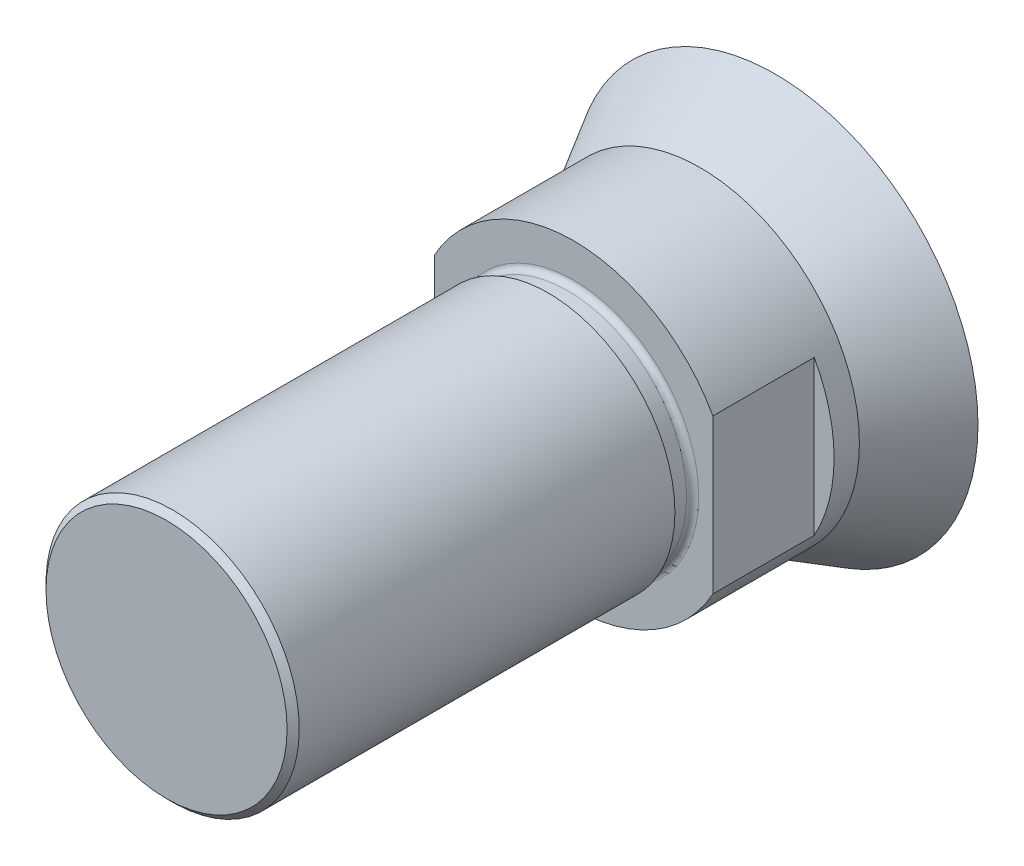
ISO-10303-21;
HEADER;
FILE_DESCRIPTION(('STEP AP214'),'2;1');
FILE_NAME('part.step','',(''),(''),'','','');
FILE_SCHEMA(('AUTOMOTIVE_DESIGN { 1 0 10303 214 1 1 1 1 }'));
ENDSEC;
DATA;
#1=APPLICATION_CONTEXT('core data for automotive mechanical design processes');
#2=APPLICATION_PROTOCOL_DEFINITION('international standard','automotive_design',2000,#1);
#3=PRODUCT_CONTEXT('',#1,'mechanical');
#4=PRODUCT('Part','Part','',(#3));
#5=PRODUCT_RELATED_PRODUCT_CATEGORY('part','',(#4));
#6=PRODUCT_DEFINITION_FORMATION('','',#4);
#7=PRODUCT_DEFINITION_CONTEXT('part definition',#1,'design');
#8=PRODUCT_DEFINITION('design','',#6,#7);
#9=PRODUCT_DEFINITION_SHAPE('','',#8);
#10=(LENGTH_UNIT() NAMED_UNIT(*) SI_UNIT(.MILLI.,.METRE.));
#11=(NAMED_UNIT(*) PLANE_ANGLE_UNIT() SI_UNIT($,.RADIAN.));
#12=(NAMED_UNIT(*) SI_UNIT($,.STERADIAN.) SOLID_ANGLE_UNIT());
#13=UNCERTAINTY_MEASURE_WITH_UNIT(LENGTH_MEASURE(1.E-05),#10,'distance_accuracy_value','');
#14=(GEOMETRIC_REPRESENTATION_CONTEXT(3) GLOBAL_UNCERTAINTY_ASSIGNED_CONTEXT((#13)) GLOBAL_UNIT_ASSIGNED_CONTEXT((#10,
#11,#12)) REPRESENTATION_CONTEXT('',''));
#15=CARTESIAN_POINT('',(0.,0.,0.));
#16=DIRECTION('',(0.,0.,1.));
#17=DIRECTION('',(1.,0.,0.));
#18=AXIS2_PLACEMENT_3D('',#15,#16,#17);
#19=CARTESIAN_POINT('',(0.,0.,469.615932215501));
#20=DIRECTION('',(0.,0.,-1.));
#21=DIRECTION('',(-1.,0.,0.));
#22=AXIS2_PLACEMENT_3D('',#19,#20,#21);
#23=PLANE('',#22);
#24=CARTESIAN_POINT('',(0.,0.,469.615932215501));
#25=DIRECTION('',(0.,0.,-1.));
#26=DIRECTION('',(-1.,0.,0.));
#27=AXIS2_PLACEMENT_3D('',#24,#25,#26);
#28=CIRCLE('',#27,50.7999999999999);
#29=CARTESIAN_POINT('',(-50.7999999999999,0.,469.615932215501));
#30=VERTEX_POINT('',#29);
#31=EDGE_CURVE('E83',#30,#30,#28,.F.);
#32=ORIENTED_EDGE('',*,*,#31,.F.);
#33=EDGE_LOOP('',(#32));
#34=FACE_BOUND('',#33,.T.);
#35=ADVANCED_FACE('F16',(#34),#23,.T.);
#36=CARTESIAN_POINT('',(0.,0.,469.615932215501));
#37=DIRECTION('',(0.,0.,-1.));
#38=DIRECTION('',(-1.,0.,0.));
#39=AXIS2_PLACEMENT_3D('',#36,#37,#38);
#40=CONICAL_SURFACE('',#39,50.7999999999999,0.523598775598302);
#41=ORIENTED_EDGE('',*,*,#31,.T.);
#42=EDGE_LOOP('',(#41));
#43=FACE_BOUND('',#42,.T.);
#44=CARTESIAN_POINT('',(0.,0.,488.4674));
#45=DIRECTION('',(0.,0.,1.));
#46=DIRECTION('',(1.,0.,0.));
#47=AXIS2_PLACEMENT_3D('',#44,#45,#46);
#48=CIRCLE('',#47,39.9160999999999);
#49=CARTESIAN_POINT('',(39.9160999999999,0.,488.4674));
#50=VERTEX_POINT('',#49);
#51=EDGE_CURVE('E94',#50,#50,#48,.T.);
#52=ORIENTED_EDGE('',*,*,#51,.F.);
#53=EDGE_LOOP('',(#52));
#54=FACE_BOUND('',#53,.T.);
#55=ADVANCED_FACE('F174',(#43,#54),#40,.T.);
#56=CARTESIAN_POINT('',(-34.925,-19.327167775181,494.8174));
#57=DIRECTION('',(0.,0.,-1.));
#58=DIRECTION('',(-1.,0.,0.));
#59=AXIS2_PLACEMENT_3D('',#56,#57,#58);
#60=PLANE('',#59);
#61=DIRECTION('',(0.,1.,0.));
#62=VECTOR('',#61,1.);
#63=CARTESIAN_POINT('',(-34.925,19.327167775181,494.8174));
#64=LINE('',#63,#62);
#65=CARTESIAN_POINT('',(-34.925,-19.327167775181,494.8174));
#66=VERTEX_POINT('',#65);
#67=CARTESIAN_POINT('',(-34.925,19.327167775181,494.8174));
#68=VERTEX_POINT('',#67);
#69=EDGE_CURVE('E89',#66,#68,#64,.T.);
#70=ORIENTED_EDGE('',*,*,#69,.T.);
#71=CARTESIAN_POINT('',(0.,0.,494.8174));
#72=DIRECTION('',(0.,0.,1.));
#73=DIRECTION('',(1.,0.,0.));
#74=AXIS2_PLACEMENT_3D('',#71,#72,#73);
#75=CIRCLE('',#74,39.9160999999999);
#76=EDGE_CURVE('E61',#66,#68,#75,.F.);
#77=ORIENTED_EDGE('',*,*,#76,.F.);
#78=EDGE_LOOP('',(#70,#77));
#79=FACE_BOUND('',#78,.T.);
#80=ADVANCED_FACE('F172',(#79),#60,.F.);
#81=CARTESIAN_POINT('',(34.925,-19.327167775181,494.8174));
#82=DIRECTION('',(0.,0.,1.));
#83=DIRECTION('',(1.,0.,0.));
#84=AXIS2_PLACEMENT_3D('',#81,#82,#83);
#85=PLANE('',#84);
#86=CARTESIAN_POINT('',(0.,0.,494.8174));
#87=DIRECTION('',(0.,0.,1.));
#88=DIRECTION('',(1.,0.,0.));
#89=AXIS2_PLACEMENT_3D('',#86,#87,#88);
#90=CIRCLE('',#89,39.9160999999999);
#91=CARTESIAN_POINT('',(34.925,19.327167775181,494.8174));
#92=VERTEX_POINT('',#91);
#93=CARTESIAN_POINT('',(34.925,-19.327167775181,494.8174));
#94=VERTEX_POINT('',#93);
#95=EDGE_CURVE('E68',#92,#94,#90,.F.);
#96=ORIENTED_EDGE('',*,*,#95,.F.);
#97=DIRECTION('',(0.,-1.,0.));
#98=VECTOR('',#97,1.);
#99=CARTESIAN_POINT('',(34.925,19.327167775181,494.8174));
#100=LINE('',#99,#98);
#101=EDGE_CURVE('E80',#92,#94,#100,.T.);
#102=ORIENTED_EDGE('',*,*,#101,.T.);
#103=EDGE_LOOP('',(#96,#102));
#104=FACE_BOUND('',#103,.T.);
#105=ADVANCED_FACE('F81',(#104),#85,.T.);
#106=CARTESIAN_POINT('',(34.925,19.327167775181,494.8174));
#107=DIRECTION('',(-1.,0.,0.));
#108=DIRECTION('',(0.,-1.,0.));
#109=AXIS2_PLACEMENT_3D('',#106,#107,#108);
#110=PLANE('',#109);
#111=DIRECTION('',(0.,0.,1.));
#112=VECTOR('',#111,1.);
#113=CARTESIAN_POINT('',(34.925,-19.327167775181,622.3));
#114=LINE('',#113,#112);
#115=CARTESIAN_POINT('',(34.925,-19.327167775181,520.2174));
#116=VERTEX_POINT('',#115);
#117=EDGE_CURVE('E73',#94,#116,#114,.T.);
#118=ORIENTED_EDGE('',*,*,#117,.F.);
#119=ORIENTED_EDGE('',*,*,#101,.F.);
#120=DIRECTION('',(0.,0.,1.));
#121=VECTOR('',#120,1.);
#122=CARTESIAN_POINT('',(34.925,19.327167775181,622.3));
#123=LINE('',#122,#121);
#124=CARTESIAN_POINT('',(34.925,19.327167775181,520.2174));
#125=VERTEX_POINT('',#124);
#126=EDGE_CURVE('E76',#125,#92,#123,.F.);
#127=ORIENTED_EDGE('',*,*,#126,.F.);
#128=DIRECTION('',(0.,1.,0.));
#129=VECTOR('',#128,1.);
#130=CARTESIAN_POINT('',(34.925,39.9160999999999,520.2174));
#131=LINE('',#130,#129);
#132=EDGE_CURVE('E78',#125,#116,#131,.F.);
#133=ORIENTED_EDGE('',*,*,#132,.T.);
#134=EDGE_LOOP('',(#118,#119,#127,#133));
#135=FACE_BOUND('',#134,.T.);
#136=ADVANCED_FACE('F85',(#135),#110,.F.);
#137=CARTESIAN_POINT('',(-34.925,19.327167775181,494.8174));
#138=DIRECTION('',(1.,0.,0.));
#139=DIRECTION('',(0.,0.,-1.));
#140=AXIS2_PLACEMENT_3D('',#137,#138,#139);
#141=PLANE('',#140);
#142=DIRECTION('',(0.,0.,1.));
#143=VECTOR('',#142,1.);
#144=CARTESIAN_POINT('',(-34.925,19.327167775181,622.3));
#145=LINE('',#144,#143);
#146=CARTESIAN_POINT('',(-34.925,19.327167775181,520.2174));
#147=VERTEX_POINT('',#146);
#148=EDGE_CURVE('E113',#68,#147,#145,.T.);
#149=ORIENTED_EDGE('',*,*,#148,.F.);
#150=ORIENTED_EDGE('',*,*,#69,.F.);
#151=DIRECTION('',(0.,0.,-1.));
#152=VECTOR('',#151,1.);
#153=CARTESIAN_POINT('',(-34.925,-19.327167775181,494.8174));
#154=LINE('',#153,#152);
#155=CARTESIAN_POINT('',(-34.925,-19.327167775181,520.2174));
#156=VERTEX_POINT('',#155);
#157=EDGE_CURVE('E87',#156,#66,#154,.T.);
#158=ORIENTED_EDGE('',*,*,#157,.F.);
#159=DIRECTION('',(0.,1.,0.));
#160=VECTOR('',#159,1.);
#161=CARTESIAN_POINT('',(-34.925,39.9160999999999,520.2174));
#162=LINE('',#161,#160);
#163=EDGE_CURVE('E109',#156,#147,#162,.T.);
#164=ORIENTED_EDGE('',*,*,#163,.T.);
#165=EDGE_LOOP('',(#149,#150,#158,#164));
#166=FACE_BOUND('',#165,.T.);
#167=ADVANCED_FACE('F171',(#166),#141,.F.);
#168=CARTESIAN_POINT('',(0.,0.,622.3));
#169=DIRECTION('',(0.,0.,1.));
#170=DIRECTION('',(1.,0.,0.));
#171=AXIS2_PLACEMENT_3D('',#168,#169,#170);
#172=CYLINDRICAL_SURFACE('',#171,39.9160999999999);
#173=ORIENTED_EDGE('',*,*,#157,.T.);
#174=ORIENTED_EDGE('',*,*,#76,.T.);
#175=ORIENTED_EDGE('',*,*,#148,.T.);
#176=CARTESIAN_POINT('',(0.,0.,520.2174));
#177=DIRECTION('',(0.,0.,1.));
#178=DIRECTION('',(1.,0.,0.));
#179=AXIS2_PLACEMENT_3D('',#176,#177,#178);
#180=CIRCLE('',#179,39.9160999999999);
#181=EDGE_CURVE('E106',#147,#125,#180,.F.);
#182=ORIENTED_EDGE('',*,*,#181,.T.);
#183=ORIENTED_EDGE('',*,*,#126,.T.);
#184=ORIENTED_EDGE('',*,*,#95,.T.);
#185=ORIENTED_EDGE('',*,*,#117,.T.);
#186=CARTESIAN_POINT('',(0.,0.,520.2174));
#187=DIRECTION('',(0.,0.,1.));
#188=DIRECTION('',(1.,0.,0.));
#189=AXIS2_PLACEMENT_3D('',#186,#187,#188);
#190=CIRCLE('',#189,39.9160999999999);
#191=EDGE_CURVE('E110',#116,#156,#190,.F.);
#192=ORIENTED_EDGE('',*,*,#191,.T.);
#193=EDGE_LOOP('',(#173,#174,#175,#182,#183,#184,#185,#192));
#194=FACE_BOUND('',#193,.T.);
#195=ORIENTED_EDGE('',*,*,#51,.T.);
#196=EDGE_LOOP('',(#195));
#197=FACE_BOUND('',#196,.T.);
#198=ADVANCED_FACE('F70',(#194,#197),#172,.T.);
#199=CARTESIAN_POINT('',(0.,39.9160999999999,520.2174));
#200=DIRECTION('',(0.,0.,-1.));
#201=DIRECTION('',(-1.,0.,0.));
#202=AXIS2_PLACEMENT_3D('',#199,#200,#201);
#203=PLANE('',#202);
#204=ORIENTED_EDGE('',*,*,#163,.F.);
#205=ORIENTED_EDGE('',*,*,#191,.F.);
#206=ORIENTED_EDGE('',*,*,#132,.F.);
#207=ORIENTED_EDGE('',*,*,#181,.F.);
#208=EDGE_LOOP('',(#204,#205,#206,#207));
#209=FACE_BOUND('',#208,.T.);
#210=CARTESIAN_POINT('',(0.,0.,520.2174));
#211=DIRECTION('',(0.,0.,1.));
#212=DIRECTION('',(-1.,0.,0.));
#213=AXIS2_PLACEMENT_3D('',#210,#211,#212);
#214=CIRCLE('',#213,31.369);
#215=CARTESIAN_POINT('',(31.369,0.,520.2174));
#216=VERTEX_POINT('',#215);
#217=CARTESIAN_POINT('',(-31.369,0.,520.2174));
#218=VERTEX_POINT('',#217);
#219=EDGE_CURVE('E108',#216,#218,#214,.F.);
#220=ORIENTED_EDGE('',*,*,#219,.T.);
#221=CARTESIAN_POINT('',(0.,0.,520.2174));
#222=DIRECTION('',(0.,0.,1.));
#223=DIRECTION('',(1.,0.,0.));
#224=AXIS2_PLACEMENT_3D('',#221,#222,#223);
#225=CIRCLE('',#224,31.369);
#226=EDGE_CURVE('E35',#218,#216,#225,.F.);
#227=ORIENTED_EDGE('',*,*,#226,.T.);
#228=EDGE_LOOP('',(#220,#227));
#229=FACE_BOUND('',#228,.T.);
#230=ADVANCED_FACE('F131',(#209,#229),#203,.F.);
#231=CARTESIAN_POINT('',(0.,0.,521.7414));
#232=DIRECTION('',(0.,0.,1.));
#233=DIRECTION('',(1.,0.,0.));
#234=AXIS2_PLACEMENT_3D('',#231,#232,#233);
#235=TOROIDAL_SURFACE('',#234,31.3689999999999,1.52399999999999);
#236=CARTESIAN_POINT('',(0.,0.,521.7414));
#237=DIRECTION('',(0.,0.,1.));
#238=DIRECTION('',(1.,0.,0.));
#239=AXIS2_PLACEMENT_3D('',#236,#237,#238);
#240=CIRCLE('',#239,29.8449999999999);
#241=CARTESIAN_POINT('',(29.8449999999999,0.,521.7414));
#242=VERTEX_POINT('',#241);
#243=EDGE_CURVE('E105',#242,#242,#240,.T.);
#244=ORIENTED_EDGE('',*,*,#243,.F.);
#245=EDGE_LOOP('',(#244));
#246=FACE_BOUND('',#245,.T.);
#247=ORIENTED_EDGE('',*,*,#219,.F.);
#248=ORIENTED_EDGE('',*,*,#226,.F.);
#249=EDGE_LOOP('',(#247,#248));
#250=FACE_BOUND('',#249,.T.);
#251=ADVANCED_FACE('F116',(#246,#250),#235,.F.);
#252=CARTESIAN_POINT('',(0.,0.,622.3));
#253=DIRECTION('',(0.,0.,1.));
#254=DIRECTION('',(1.,0.,0.));
#255=AXIS2_PLACEMENT_3D('',#252,#253,#254);
#256=CYLINDRICAL_SURFACE('',#255,29.8449999999999);
#257=CARTESIAN_POINT('',(0.,0.,526.5674));
#258=DIRECTION('',(0.,0.,1.));
#259=DIRECTION('',(1.,0.,0.));
#260=AXIS2_PLACEMENT_3D('',#257,#258,#259);
#261=CIRCLE('',#260,29.8449999999999);
#262=CARTESIAN_POINT('',(29.8449999999999,0.,526.5674));
#263=VERTEX_POINT('',#262);
#264=EDGE_CURVE('E102',#263,#263,#261,.F.);
#265=ORIENTED_EDGE('',*,*,#264,.T.);
#266=EDGE_LOOP('',(#265));
#267=FACE_BOUND('',#266,.T.);
#268=ORIENTED_EDGE('',*,*,#243,.T.);
#269=EDGE_LOOP('',(#268));
#270=FACE_BOUND('',#269,.T.);
#271=ADVANCED_FACE('F130',(#267,#270),#256,.T.);
#272=CARTESIAN_POINT('',(0.,30.2260000000001,622.3));
#273=DIRECTION('',(0.,0.,-1.));
#274=DIRECTION('',(-1.,0.,0.));
#275=AXIS2_PLACEMENT_3D('',#272,#273,#274);
#276=PLANE('',#275);
#277=CARTESIAN_POINT('',(0.,0.,622.3));
#278=DIRECTION('',(0.,0.,-1.));
#279=DIRECTION('',(0.,1.,0.));
#280=AXIS2_PLACEMENT_3D('',#277,#278,#279);
#281=CIRCLE('',#280,30.2260000000001);
#282=CARTESIAN_POINT('',(0.,30.2260000000001,622.3));
#283=VERTEX_POINT('',#282);
#284=EDGE_CURVE('E99',#283,#283,#281,.T.);
#285=ORIENTED_EDGE('',*,*,#284,.F.);
#286=EDGE_LOOP('',(#285));
#287=FACE_BOUND('',#286,.T.);
#288=ADVANCED_FACE('F197',(#287),#276,.F.);
#289=CARTESIAN_POINT('',(0.,29.8449999999999,526.5674));
#290=DIRECTION('',(0.,0.,1.));
#291=DIRECTION('',(1.,0.,0.));
#292=AXIS2_PLACEMENT_3D('',#289,#290,#291);
#293=PLANE('',#292);
#294=ORIENTED_EDGE('',*,*,#264,.F.);
#295=EDGE_LOOP('',(#294));
#296=FACE_BOUND('',#295,.T.);
#297=CARTESIAN_POINT('',(0.,0.,526.5674));
#298=DIRECTION('',(0.,0.,1.));
#299=DIRECTION('',(1.,0.,0.));
#300=AXIS2_PLACEMENT_3D('',#297,#298,#299);
#301=CIRCLE('',#300,31.75);
#302=CARTESIAN_POINT('',(31.75,0.,526.5674));
#303=VERTEX_POINT('',#302);
#304=EDGE_CURVE('E27',#303,#303,#301,.T.);
#305=ORIENTED_EDGE('',*,*,#304,.F.);
#306=EDGE_LOOP('',(#305));
#307=FACE_BOUND('',#306,.T.);
#308=ADVANCED_FACE('F191',(#296,#307),#293,.F.);
#309=CARTESIAN_POINT('',(0.,0.,620.776));
#310=DIRECTION('',(0.,0.,-1.));
#311=DIRECTION('',(0.,1.,0.));
#312=AXIS2_PLACEMENT_3D('',#309,#310,#311);
#313=CONICAL_SURFACE('',#312,31.75,0.785398163397419);
#314=CARTESIAN_POINT('',(0.,0.,620.776));
#315=DIRECTION('',(0.,0.,1.));
#316=DIRECTION('',(1.,0.,0.));
#317=AXIS2_PLACEMENT_3D('',#314,#315,#316);
#318=CIRCLE('',#317,31.75);
#319=CARTESIAN_POINT('',(31.75,0.,620.776));
#320=VERTEX_POINT('',#319);
#321=EDGE_CURVE('E10',#320,#320,#318,.F.);
#322=ORIENTED_EDGE('',*,*,#321,.F.);
#323=EDGE_LOOP('',(#322));
#324=FACE_BOUND('',#323,.T.);
#325=ORIENTED_EDGE('',*,*,#284,.T.);
#326=EDGE_LOOP('',(#325));
#327=FACE_BOUND('',#326,.T.);
#328=ADVANCED_FACE('F185',(#324,#327),#313,.T.);
#329=CARTESIAN_POINT('',(0.,0.,622.3));
#330=DIRECTION('',(0.,0.,1.));
#331=DIRECTION('',(1.,0.,0.));
#332=AXIS2_PLACEMENT_3D('',#329,#330,#331);
#333=CYLINDRICAL_SURFACE('',#332,31.75);
#334=ORIENTED_EDGE('',*,*,#321,.T.);
#335=EDGE_LOOP('',(#334));
#336=FACE_BOUND('',#335,.T.);
#337=ORIENTED_EDGE('',*,*,#304,.T.);
#338=EDGE_LOOP('',(#337));
#339=FACE_BOUND('',#338,.T.);
#340=ADVANCED_FACE('F183',(#336,#339),#333,.T.);
#341=CLOSED_SHELL('',(#35,#55,#80,#105,#136,#167,#198,#230,#251,#271,#288,#308,#328,#340));
#342=MANIFOLD_SOLID_BREP('B1',#341);
#343=ADVANCED_BREP_SHAPE_REPRESENTATION('',(#18,#342),#14);
#344=SHAPE_DEFINITION_REPRESENTATION(#9,#343);
ENDSEC;
END-ISO-10303-21;
